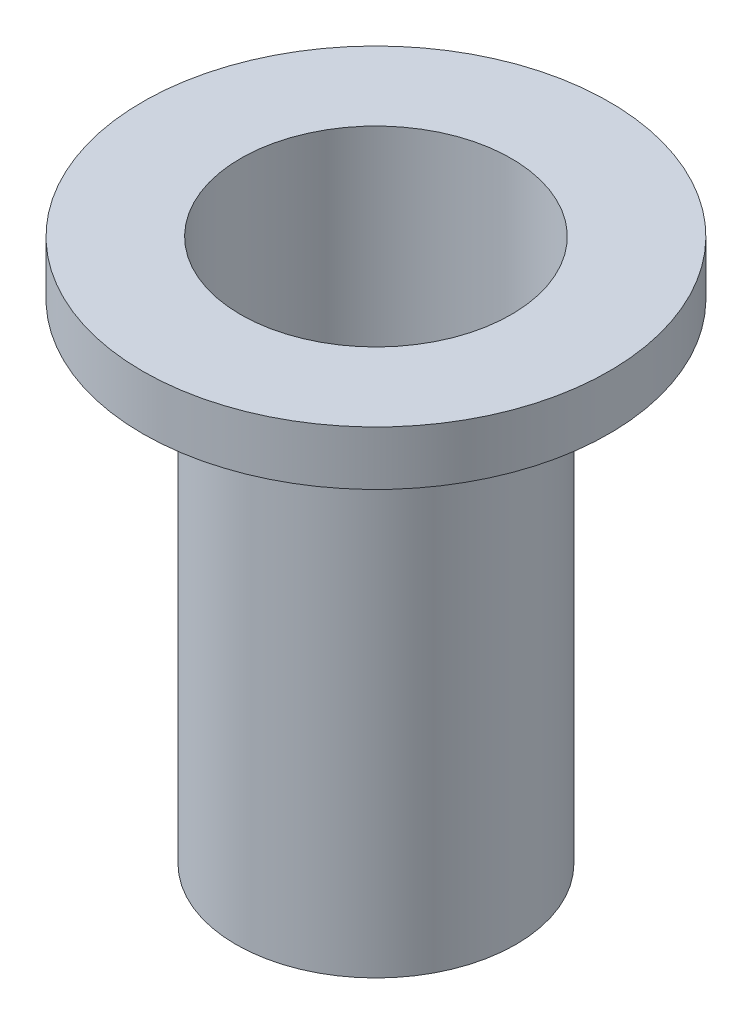
ISO-10303-21;
HEADER;
FILE_DESCRIPTION(('STEP AP214'),'2;1');
FILE_NAME('part.step','',(''),(''),'','','');
FILE_SCHEMA(('AUTOMOTIVE_DESIGN { 1 0 10303 214 1 1 1 1 }'));
ENDSEC;
DATA;
#1=APPLICATION_CONTEXT('core data for automotive mechanical design processes');
#2=APPLICATION_PROTOCOL_DEFINITION('international standard','automotive_design',2000,#1);
#3=PRODUCT_CONTEXT('',#1,'mechanical');
#4=PRODUCT('Part','Part','',(#3));
#5=PRODUCT_RELATED_PRODUCT_CATEGORY('part','',(#4));
#6=PRODUCT_DEFINITION_FORMATION('','',#4);
#7=PRODUCT_DEFINITION_CONTEXT('part definition',#1,'design');
#8=PRODUCT_DEFINITION('design','',#6,#7);
#9=PRODUCT_DEFINITION_SHAPE('','',#8);
#10=(LENGTH_UNIT() NAMED_UNIT(*) SI_UNIT(.MILLI.,.METRE.));
#11=(NAMED_UNIT(*) PLANE_ANGLE_UNIT() SI_UNIT($,.RADIAN.));
#12=(NAMED_UNIT(*) SI_UNIT($,.STERADIAN.) SOLID_ANGLE_UNIT());
#13=UNCERTAINTY_MEASURE_WITH_UNIT(LENGTH_MEASURE(1.E-05),#10,'distance_accuracy_value','');
#14=(GEOMETRIC_REPRESENTATION_CONTEXT(3) GLOBAL_UNCERTAINTY_ASSIGNED_CONTEXT((#13)) GLOBAL_UNIT_ASSIGNED_CONTEXT((#10,
#11,#12)) REPRESENTATION_CONTEXT('',''));
#15=CARTESIAN_POINT('',(0.,0.,0.));
#16=DIRECTION('',(0.,0.,1.));
#17=DIRECTION('',(1.,0.,0.));
#18=AXIS2_PLACEMENT_3D('',#15,#16,#17);
#19=CARTESIAN_POINT('',(0.,0.,0.));
#20=DIRECTION('',(0.,1.,0.));
#21=DIRECTION('',(0.,0.,1.));
#22=AXIS2_PLACEMENT_3D('',#19,#20,#21);
#23=PLANE('',#22);
#24=CARTESIAN_POINT('',(0.,0.,0.));
#25=DIRECTION('',(0.,1.,0.));
#26=DIRECTION('',(0.,0.,1.));
#27=AXIS2_PLACEMENT_3D('',#24,#25,#26);
#28=CIRCLE('',#27,1.5);
#29=CARTESIAN_POINT('',(0.,0.,1.5));
#30=VERTEX_POINT('',#29);
#31=EDGE_CURVE('E34',#30,#30,#28,.T.);
#32=ORIENTED_EDGE('',*,*,#31,.F.);
#33=EDGE_LOOP('',(#32));
#34=FACE_BOUND('',#33,.T.);
#35=CARTESIAN_POINT('',(0.,0.,0.));
#36=DIRECTION('',(0.,1.,0.));
#37=DIRECTION('',(0.,0.,1.));
#38=AXIS2_PLACEMENT_3D('',#35,#36,#37);
#39=CIRCLE('',#38,1.45);
#40=CARTESIAN_POINT('',(0.,0.,1.45));
#41=VERTEX_POINT('',#40);
#42=EDGE_CURVE('E41',#41,#41,#39,.T.);
#43=ORIENTED_EDGE('',*,*,#42,.T.);
#44=EDGE_LOOP('',(#43));
#45=FACE_BOUND('',#44,.T.);
#46=ADVANCED_FACE('F30',(#34,#45),#23,.F.);
#47=CARTESIAN_POINT('',(0.,5.24,0.));
#48=DIRECTION('',(0.,-1.,0.));
#49=DIRECTION('',(0.,0.,-1.));
#50=AXIS2_PLACEMENT_3D('',#47,#48,#49);
#51=CYLINDRICAL_SURFACE('',#50,1.5);
#52=CARTESIAN_POINT('',(0.,5.24,0.));
#53=DIRECTION('',(0.,1.,0.));
#54=DIRECTION('',(0.,0.,1.));
#55=AXIS2_PLACEMENT_3D('',#52,#53,#54);
#56=CIRCLE('',#55,1.5);
#57=CARTESIAN_POINT('',(0.,5.24,1.5));
#58=VERTEX_POINT('',#57);
#59=EDGE_CURVE('E10',#58,#58,#56,.T.);
#60=ORIENTED_EDGE('',*,*,#59,.F.);
#61=EDGE_LOOP('',(#60));
#62=FACE_BOUND('',#61,.T.);
#63=ORIENTED_EDGE('',*,*,#31,.T.);
#64=EDGE_LOOP('',(#63));
#65=FACE_BOUND('',#64,.T.);
#66=ADVANCED_FACE('F32',(#62,#65),#51,.T.);
#67=CARTESIAN_POINT('',(0.,5.24,0.));
#68=DIRECTION('',(0.,-1.,0.));
#69=DIRECTION('',(0.,0.,-1.));
#70=AXIS2_PLACEMENT_3D('',#67,#68,#69);
#71=CYLINDRICAL_SURFACE('',#70,1.45);
#72=ORIENTED_EDGE('',*,*,#42,.F.);
#73=EDGE_LOOP('',(#72));
#74=FACE_BOUND('',#73,.T.);
#75=CARTESIAN_POINT('',(0.,5.82,0.));
#76=DIRECTION('',(0.,1.,0.));
#77=DIRECTION('',(0.,0.,1.));
#78=AXIS2_PLACEMENT_3D('',#75,#76,#77);
#79=CIRCLE('',#78,1.45);
#80=CARTESIAN_POINT('',(0.,5.82,1.45));
#81=VERTEX_POINT('',#80);
#82=EDGE_CURVE('E49',#81,#81,#79,.T.);
#83=ORIENTED_EDGE('',*,*,#82,.T.);
#84=EDGE_LOOP('',(#83));
#85=FACE_BOUND('',#84,.T.);
#86=ADVANCED_FACE('F55',(#74,#85),#71,.F.);
#87=CARTESIAN_POINT('',(0.,5.82,0.));
#88=DIRECTION('',(0.,1.,0.));
#89=DIRECTION('',(0.,0.,1.));
#90=AXIS2_PLACEMENT_3D('',#87,#88,#89);
#91=PLANE('',#90);
#92=CARTESIAN_POINT('',(0.,5.82,0.));
#93=DIRECTION('',(0.,1.,0.));
#94=DIRECTION('',(0.,0.,1.));
#95=AXIS2_PLACEMENT_3D('',#92,#93,#94);
#96=CIRCLE('',#95,2.5);
#97=CARTESIAN_POINT('',(0.,5.82,2.5));
#98=VERTEX_POINT('',#97);
#99=EDGE_CURVE('E45',#98,#98,#96,.T.);
#100=ORIENTED_EDGE('',*,*,#99,.T.);
#101=EDGE_LOOP('',(#100));
#102=FACE_BOUND('',#101,.T.);
#103=ORIENTED_EDGE('',*,*,#82,.F.);
#104=EDGE_LOOP('',(#103));
#105=FACE_BOUND('',#104,.T.);
#106=ADVANCED_FACE('F57',(#102,#105),#91,.T.);
#107=CARTESIAN_POINT('',(0.,5.24,0.));
#108=DIRECTION('',(0.,1.,0.));
#109=DIRECTION('',(0.,0.,1.));
#110=AXIS2_PLACEMENT_3D('',#107,#108,#109);
#111=PLANE('',#110);
#112=ORIENTED_EDGE('',*,*,#59,.T.);
#113=EDGE_LOOP('',(#112));
#114=FACE_BOUND('',#113,.T.);
#115=CARTESIAN_POINT('',(0.,5.24,0.));
#116=DIRECTION('',(0.,1.,0.));
#117=DIRECTION('',(0.,0.,1.));
#118=AXIS2_PLACEMENT_3D('',#115,#116,#117);
#119=CIRCLE('',#118,2.5);
#120=CARTESIAN_POINT('',(0.,5.24,2.5));
#121=VERTEX_POINT('',#120);
#122=EDGE_CURVE('E46',#121,#121,#119,.T.);
#123=ORIENTED_EDGE('',*,*,#122,.F.);
#124=EDGE_LOOP('',(#123));
#125=FACE_BOUND('',#124,.T.);
#126=ADVANCED_FACE('F59',(#114,#125),#111,.F.);
#127=CARTESIAN_POINT('',(0.,5.82,0.));
#128=DIRECTION('',(0.,-1.,0.));
#129=DIRECTION('',(0.,0.,-1.));
#130=AXIS2_PLACEMENT_3D('',#127,#128,#129);
#131=CYLINDRICAL_SURFACE('',#130,2.5);
#132=ORIENTED_EDGE('',*,*,#99,.F.);
#133=EDGE_LOOP('',(#132));
#134=FACE_BOUND('',#133,.T.);
#135=ORIENTED_EDGE('',*,*,#122,.T.);
#136=EDGE_LOOP('',(#135));
#137=FACE_BOUND('',#136,.T.);
#138=ADVANCED_FACE('F66',(#134,#137),#131,.T.);
#139=CLOSED_SHELL('',(#46,#66,#86,#106,#126,#138));
#140=MANIFOLD_SOLID_BREP('B2',#139);
#141=ADVANCED_BREP_SHAPE_REPRESENTATION('',(#18,#140),#14);
#142=SHAPE_DEFINITION_REPRESENTATION(#9,#141);
ENDSEC;
END-ISO-10303-21;
